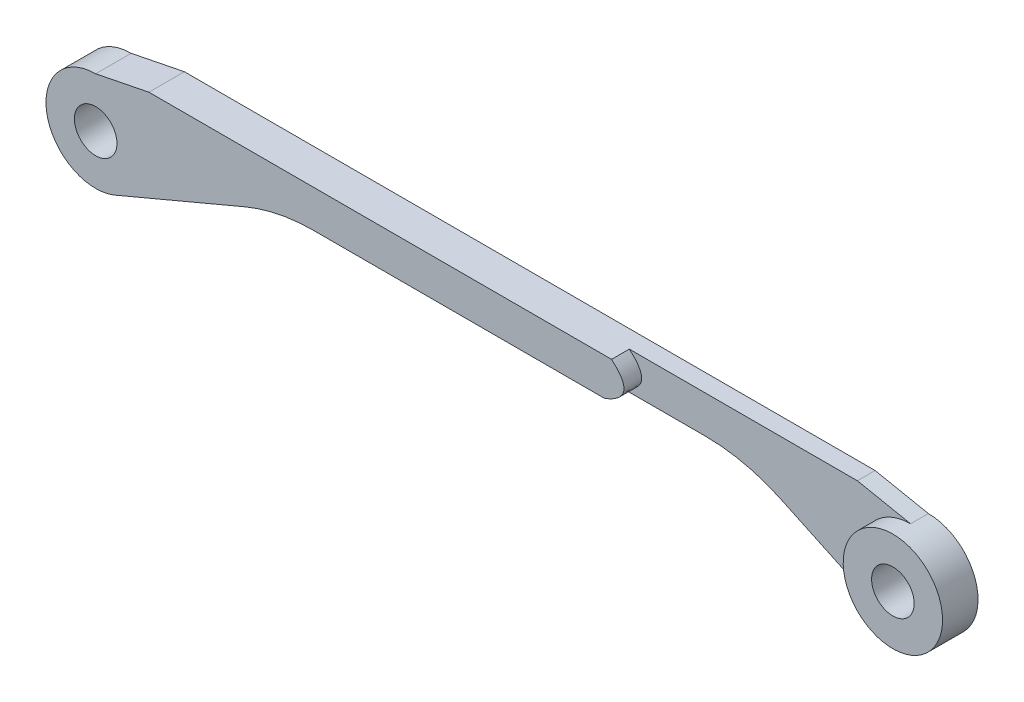
ISO-10303-21;
HEADER;
FILE_DESCRIPTION(('STEP AP214'),'2;1');
FILE_NAME('part.step','',(''),(''),'','','');
FILE_SCHEMA(('AUTOMOTIVE_DESIGN { 1 0 10303 214 1 1 1 1 }'));
ENDSEC;
DATA;
#1=APPLICATION_CONTEXT('core data for automotive mechanical design processes');
#2=APPLICATION_PROTOCOL_DEFINITION('international standard','automotive_design',2000,#1);
#3=PRODUCT_CONTEXT('',#1,'mechanical');
#4=PRODUCT('Part','Part','',(#3));
#5=PRODUCT_RELATED_PRODUCT_CATEGORY('part','',(#4));
#6=PRODUCT_DEFINITION_FORMATION('','',#4);
#7=PRODUCT_DEFINITION_CONTEXT('part definition',#1,'design');
#8=PRODUCT_DEFINITION('design','',#6,#7);
#9=PRODUCT_DEFINITION_SHAPE('','',#8);
#10=(LENGTH_UNIT() NAMED_UNIT(*) SI_UNIT(.MILLI.,.METRE.));
#11=(NAMED_UNIT(*) PLANE_ANGLE_UNIT() SI_UNIT($,.RADIAN.));
#12=(NAMED_UNIT(*) SI_UNIT($,.STERADIAN.) SOLID_ANGLE_UNIT());
#13=UNCERTAINTY_MEASURE_WITH_UNIT(LENGTH_MEASURE(1.E-05),#10,'distance_accuracy_value','');
#14=(GEOMETRIC_REPRESENTATION_CONTEXT(3) GLOBAL_UNCERTAINTY_ASSIGNED_CONTEXT((#13)) GLOBAL_UNIT_ASSIGNED_CONTEXT((#10,
#11,#12)) REPRESENTATION_CONTEXT('',''));
#15=CARTESIAN_POINT('',(0.,0.,0.));
#16=DIRECTION('',(0.,0.,1.));
#17=DIRECTION('',(1.,0.,0.));
#18=AXIS2_PLACEMENT_3D('',#15,#16,#17);
#19=CARTESIAN_POINT('',(-57.845130198065,-43.5295238724371,5.));
#20=DIRECTION('',(0.,0.,1.));
#21=DIRECTION('',(1.,0.,0.));
#22=AXIS2_PLACEMENT_3D('',#19,#20,#21);
#23=PLANE('',#22);
#24=DIRECTION('',(0.905027741446098,-0.425352544617962,0.));
#25=VECTOR('',#24,1.);
#26=CARTESIAN_POINT('',(-5.95493562465147,-12.6703883802454,5.));
#27=LINE('',#26,#25);
#28=CARTESIAN_POINT('',(-36.577502967167,1.7218631998678,5.));
#29=VERTEX_POINT('',#28);
#30=CARTESIAN_POINT('',(-5.95493562465147,-12.6703883802454,5.));
#31=VERTEX_POINT('',#30);
#32=EDGE_CURVE('E186',#29,#31,#27,.T.);
#33=ORIENTED_EDGE('',*,*,#32,.T.);
#34=CARTESIAN_POINT('',(0.,0.,5.));
#35=DIRECTION('',(0.,0.,1.));
#36=DIRECTION('',(1.,0.,0.));
#37=AXIS2_PLACEMENT_3D('',#34,#35,#36);
#38=CIRCLE('',#37,14.);
#39=CARTESIAN_POINT('',(0.,14.,5.));
#40=VERTEX_POINT('',#39);
#41=EDGE_CURVE('E170',#40,#31,#38,.T.);
#42=ORIENTED_EDGE('',*,*,#41,.F.);
#43=DIRECTION('',(-0.98058067569092,0.196116135138185,0.));
#44=VECTOR('',#43,1.);
#45=CARTESIAN_POINT('',(2.69230769230771,13.4615384615385,5.));
#46=LINE('',#45,#44);
#47=CARTESIAN_POINT('',(-15.,17.,5.));
#48=VERTEX_POINT('',#47);
#49=EDGE_CURVE('E181',#40,#48,#46,.T.);
#50=ORIENTED_EDGE('',*,*,#49,.T.);
#51=DIRECTION('',(-1.,0.,0.));
#52=VECTOR('',#51,1.);
#53=CARTESIAN_POINT('',(0.,17.,5.));
#54=LINE('',#53,#52);
#55=CARTESIAN_POINT('',(-79.2716069594435,17.,5.));
#56=VERTEX_POINT('',#55);
#57=EDGE_CURVE('E185',#48,#56,#54,.T.);
#58=ORIENTED_EDGE('',*,*,#57,.T.);
#59=CARTESIAN_POINT('',(-79.2716069594435,17.,5.));
#60=CARTESIAN_POINT('',(-71.4034946211549,10.2559083754016,5.));
#61=CARTESIAN_POINT('',(-81.2732419921328,6.47047612756292,5.));
#62=B_SPLINE_CURVE_WITH_KNOTS('',2,(#59,#60,#61),.UNSPECIFIED.,.F.,.F.,(3,3),(0.,1.),.UNSPECIFIED.);
#63=CARTESIAN_POINT('',(-81.2732419921328,6.47047612756292,5.));
#64=VERTEX_POINT('',#63);
#65=EDGE_CURVE('E209',#56,#64,#62,.T.);
#66=ORIENTED_EDGE('',*,*,#65,.T.);
#67=DIRECTION('',(1.,0.,0.));
#68=VECTOR('',#67,1.);
#69=CARTESIAN_POINT('',(0.,6.47047612756292,5.));
#70=LINE('',#69,#68);
#71=CARTESIAN_POINT('',(-57.845130198065,6.47047612756292,5.));
#72=VERTEX_POINT('',#71);
#73=EDGE_CURVE('E90',#64,#72,#70,.T.);
#74=ORIENTED_EDGE('',*,*,#73,.T.);
#75=CARTESIAN_POINT('',(-57.845130198065,-43.5295238724371,5.));
#76=DIRECTION('',(0.,0.,1.));
#77=DIRECTION('',(1.,0.,0.));
#78=AXIS2_PLACEMENT_3D('',#75,#76,#77);
#79=CIRCLE('',#78,50.);
#80=EDGE_CURVE('E201',#29,#72,#79,.T.);
#81=ORIENTED_EDGE('',*,*,#80,.F.);
#82=EDGE_LOOP('',(#33,#42,#50,#58,#66,#74,#81));
#83=FACE_BOUND('',#82,.T.);
#84=ADVANCED_FACE('F74',(#83),#23,.T.);
#85=CARTESIAN_POINT('',(-5.95493562465147,-12.6703883802454,10.));
#86=DIRECTION('',(0.425352544617962,0.905027741446098,0.));
#87=DIRECTION('',(-0.905027741446098,0.425352544617962,0.));
#88=AXIS2_PLACEMENT_3D('',#85,#86,#87);
#89=PLANE('',#88);
#90=ORIENTED_EDGE('',*,*,#32,.F.);
#91=DIRECTION('',(0.,0.,-1.));
#92=VECTOR('',#91,1.);
#93=CARTESIAN_POINT('',(-36.5775029671669,1.7218631998678,0.));
#94=LINE('',#93,#92);
#95=CARTESIAN_POINT('',(-36.577502967167,1.7218631998678,0.));
#96=VERTEX_POINT('',#95);
#97=EDGE_CURVE('E561',#29,#96,#94,.T.);
#98=ORIENTED_EDGE('',*,*,#97,.T.);
#99=DIRECTION('',(0.905027741446098,-0.425352544617962,0.));
#100=VECTOR('',#99,1.);
#101=CARTESIAN_POINT('',(-5.95493562465147,-12.6703883802454,0.));
#102=LINE('',#101,#100);
#103=CARTESIAN_POINT('',(-5.95493562465147,-12.6703883802454,0.));
#104=VERTEX_POINT('',#103);
#105=EDGE_CURVE('E512',#96,#104,#102,.T.);
#106=ORIENTED_EDGE('',*,*,#105,.T.);
#107=DIRECTION('',(0.,0.,-1.));
#108=VECTOR('',#107,1.);
#109=CARTESIAN_POINT('',(-5.95493562465147,-12.6703883802454,10.));
#110=LINE('',#109,#108);
#111=EDGE_CURVE('E177',#31,#104,#110,.T.);
#112=ORIENTED_EDGE('',*,*,#111,.F.);
#113=EDGE_LOOP('',(#90,#98,#106,#112));
#114=FACE_BOUND('',#113,.T.);
#115=ADVANCED_FACE('F270',(#114),#89,.F.);
#116=CARTESIAN_POINT('',(0.,0.,10.));
#117=DIRECTION('',(0.,0.,-1.));
#118=DIRECTION('',(-1.,0.,0.));
#119=AXIS2_PLACEMENT_3D('',#116,#117,#118);
#120=CYLINDRICAL_SURFACE('',#119,14.);
#121=DIRECTION('',(0.,0.,-1.));
#122=VECTOR('',#121,1.);
#123=CARTESIAN_POINT('',(0.,14.,10.));
#124=LINE('',#123,#122);
#125=CARTESIAN_POINT('',(0.,14.,0.));
#126=VERTEX_POINT('',#125);
#127=EDGE_CURVE('E165',#40,#126,#124,.T.);
#128=ORIENTED_EDGE('',*,*,#127,.F.);
#129=ORIENTED_EDGE('',*,*,#41,.T.);
#130=ORIENTED_EDGE('',*,*,#111,.T.);
#131=CARTESIAN_POINT('',(0.,0.,0.));
#132=DIRECTION('',(0.,0.,1.));
#133=DIRECTION('',(1.,0.,0.));
#134=AXIS2_PLACEMENT_3D('',#131,#132,#133);
#135=CIRCLE('',#134,14.);
#136=EDGE_CURVE('E172',#104,#126,#135,.T.);
#137=ORIENTED_EDGE('',*,*,#136,.T.);
#138=EDGE_LOOP('',(#128,#129,#130,#137));
#139=FACE_BOUND('',#138,.T.);
#140=CARTESIAN_POINT('',(0.,0.,10.));
#141=DIRECTION('',(0.,0.,1.));
#142=DIRECTION('',(1.,0.,0.));
#143=AXIS2_PLACEMENT_3D('',#140,#141,#142);
#144=CIRCLE('',#143,14.);
#145=CARTESIAN_POINT('',(14.,0.,10.));
#146=VERTEX_POINT('',#145);
#147=EDGE_CURVE('E195',#146,#146,#144,.T.);
#148=ORIENTED_EDGE('',*,*,#147,.F.);
#149=EDGE_LOOP('',(#148));
#150=FACE_BOUND('',#149,.T.);
#151=ADVANCED_FACE('F167',(#139,#150),#120,.T.);
#152=CARTESIAN_POINT('',(2.69230769230771,13.4615384615385,10.));
#153=DIRECTION('',(0.196116135138185,0.98058067569092,0.));
#154=DIRECTION('',(-0.98058067569092,0.196116135138185,0.));
#155=AXIS2_PLACEMENT_3D('',#152,#153,#154);
#156=PLANE('',#155);
#157=DIRECTION('',(0.,0.,-1.));
#158=VECTOR('',#157,1.);
#159=CARTESIAN_POINT('',(-15.,17.,10.));
#160=LINE('',#159,#158);
#161=CARTESIAN_POINT('',(-15.,17.,0.));
#162=VERTEX_POINT('',#161);
#163=EDGE_CURVE('E178',#48,#162,#160,.T.);
#164=ORIENTED_EDGE('',*,*,#163,.F.);
#165=ORIENTED_EDGE('',*,*,#49,.F.);
#166=ORIENTED_EDGE('',*,*,#127,.T.);
#167=DIRECTION('',(0.98058067569092,-0.196116135138185,0.));
#168=VECTOR('',#167,1.);
#169=CARTESIAN_POINT('',(2.69230769230771,13.4615384615385,0.));
#170=LINE('',#169,#168);
#171=EDGE_CURVE('E518',#162,#126,#170,.T.);
#172=ORIENTED_EDGE('',*,*,#171,.F.);
#173=EDGE_LOOP('',(#164,#165,#166,#172));
#174=FACE_BOUND('',#173,.T.);
#175=ADVANCED_FACE('F182',(#174),#156,.T.);
#176=CARTESIAN_POINT('',(0.,0.,10.));
#177=DIRECTION('',(0.,0.,-1.));
#178=DIRECTION('',(-1.,0.,0.));
#179=AXIS2_PLACEMENT_3D('',#176,#177,#178);
#180=CYLINDRICAL_SURFACE('',#179,6.);
#181=CARTESIAN_POINT('',(0.,0.,0.));
#182=DIRECTION('',(0.,0.,1.));
#183=DIRECTION('',(1.,0.,0.));
#184=AXIS2_PLACEMENT_3D('',#181,#182,#183);
#185=CIRCLE('',#184,6.);
#186=CARTESIAN_POINT('',(6.,0.,0.));
#187=VERTEX_POINT('',#186);
#188=EDGE_CURVE('E538',#187,#187,#185,.T.);
#189=ORIENTED_EDGE('',*,*,#188,.F.);
#190=EDGE_LOOP('',(#189));
#191=FACE_BOUND('',#190,.T.);
#192=CARTESIAN_POINT('',(0.,0.,10.));
#193=DIRECTION('',(0.,0.,1.));
#194=DIRECTION('',(1.,0.,0.));
#195=AXIS2_PLACEMENT_3D('',#192,#193,#194);
#196=CIRCLE('',#195,6.);
#197=CARTESIAN_POINT('',(6.,0.,10.));
#198=VERTEX_POINT('',#197);
#199=EDGE_CURVE('E191',#198,#198,#196,.F.);
#200=ORIENTED_EDGE('',*,*,#199,.F.);
#201=EDGE_LOOP('',(#200));
#202=FACE_BOUND('',#201,.T.);
#203=ADVANCED_FACE('F243',(#191,#202),#180,.F.);
#204=CARTESIAN_POINT('',(-57.845130198065,-43.5295238724371,10.));
#205=DIRECTION('',(0.,0.,1.));
#206=DIRECTION('',(1.,0.,0.));
#207=AXIS2_PLACEMENT_3D('',#204,#205,#206);
#208=CYLINDRICAL_SURFACE('',#207,50.);
#209=ORIENTED_EDGE('',*,*,#80,.T.);
#210=DIRECTION('',(0.,0.,-1.));
#211=VECTOR('',#210,1.);
#212=CARTESIAN_POINT('',(-57.845130198065,6.47047612756292,10.));
#213=LINE('',#212,#211);
#214=CARTESIAN_POINT('',(-57.845130198065,6.47047612756292,0.));
#215=VERTEX_POINT('',#214);
#216=EDGE_CURVE('E566',#215,#72,#213,.F.);
#217=ORIENTED_EDGE('',*,*,#216,.F.);
#218=CARTESIAN_POINT('',(-57.845130198065,-43.5295238724371,0.));
#219=DIRECTION('',(0.,0.,1.));
#220=DIRECTION('',(1.,0.,0.));
#221=AXIS2_PLACEMENT_3D('',#218,#219,#220);
#222=CIRCLE('',#221,50.);
#223=EDGE_CURVE('E572',#96,#215,#222,.T.);
#224=ORIENTED_EDGE('',*,*,#223,.F.);
#225=ORIENTED_EDGE('',*,*,#97,.F.);
#226=EDGE_LOOP('',(#209,#217,#224,#225));
#227=FACE_BOUND('',#226,.T.);
#228=ADVANCED_FACE('F246',(#227),#208,.F.);
#229=CARTESIAN_POINT('',(0.,17.,10.));
#230=DIRECTION('',(0.,1.,0.));
#231=DIRECTION('',(-1.,0.,0.));
#232=AXIS2_PLACEMENT_3D('',#229,#230,#231);
#233=PLANE('',#232);
#234=DIRECTION('',(0.,0.,1.));
#235=VECTOR('',#234,1.);
#236=CARTESIAN_POINT('',(-79.2716069594435,17.,5.));
#237=LINE('',#236,#235);
#238=CARTESIAN_POINT('',(-79.2716069594435,17.,10.));
#239=VERTEX_POINT('',#238);
#240=EDGE_CURVE('E215',#56,#239,#237,.T.);
#241=ORIENTED_EDGE('',*,*,#240,.F.);
#242=ORIENTED_EDGE('',*,*,#57,.F.);
#243=ORIENTED_EDGE('',*,*,#163,.T.);
#244=DIRECTION('',(1.,0.,0.));
#245=VECTOR('',#244,1.);
#246=CARTESIAN_POINT('',(0.,17.,0.));
#247=LINE('',#246,#245);
#248=CARTESIAN_POINT('',(-209.65,17.,0.));
#249=VERTEX_POINT('',#248);
#250=EDGE_CURVE('E521',#249,#162,#247,.T.);
#251=ORIENTED_EDGE('',*,*,#250,.F.);
#252=DIRECTION('',(0.,0.,-1.));
#253=VECTOR('',#252,1.);
#254=CARTESIAN_POINT('',(-209.65,17.,10.));
#255=LINE('',#254,#253);
#256=CARTESIAN_POINT('',(-209.65,17.,10.));
#257=VERTEX_POINT('',#256);
#258=EDGE_CURVE('E554',#257,#249,#255,.T.);
#259=ORIENTED_EDGE('',*,*,#258,.F.);
#260=DIRECTION('',(1.,0.,0.));
#261=VECTOR('',#260,1.);
#262=CARTESIAN_POINT('',(0.,17.,10.));
#263=LINE('',#262,#261);
#264=EDGE_CURVE('E546',#257,#239,#263,.T.);
#265=ORIENTED_EDGE('',*,*,#264,.T.);
#266=EDGE_LOOP('',(#241,#242,#243,#251,#259,#265));
#267=FACE_BOUND('',#266,.T.);
#268=ADVANCED_FACE('F261',(#267),#233,.T.);
#269=CARTESIAN_POINT('',(-11.3326923076922,56.6634615384613,10.));
#270=DIRECTION('',(0.196116135138183,-0.98058067569092,0.));
#271=DIRECTION('',(0.98058067569092,0.196116135138183,0.));
#272=AXIS2_PLACEMENT_3D('',#269,#270,#271);
#273=PLANE('',#272);
#274=DIRECTION('',(-0.98058067569092,-0.196116135138183,0.));
#275=VECTOR('',#274,1.);
#276=CARTESIAN_POINT('',(-11.3326923076922,56.6634615384613,0.));
#277=LINE('',#276,#275);
#278=CARTESIAN_POINT('',(-224.65,14.,0.));
#279=VERTEX_POINT('',#278);
#280=EDGE_CURVE('E525',#249,#279,#277,.T.);
#281=ORIENTED_EDGE('',*,*,#280,.T.);
#282=DIRECTION('',(0.,0.,-1.));
#283=VECTOR('',#282,1.);
#284=CARTESIAN_POINT('',(-224.65,14.,10.));
#285=LINE('',#284,#283);
#286=CARTESIAN_POINT('',(-224.65,14.,10.));
#287=VERTEX_POINT('',#286);
#288=EDGE_CURVE('E550',#287,#279,#285,.T.);
#289=ORIENTED_EDGE('',*,*,#288,.F.);
#290=DIRECTION('',(-0.98058067569092,-0.196116135138183,0.));
#291=VECTOR('',#290,1.);
#292=CARTESIAN_POINT('',(-11.3326923076922,56.6634615384613,10.));
#293=LINE('',#292,#291);
#294=EDGE_CURVE('E596',#257,#287,#293,.T.);
#295=ORIENTED_EDGE('',*,*,#294,.F.);
#296=ORIENTED_EDGE('',*,*,#258,.T.);
#297=EDGE_LOOP('',(#281,#289,#295,#296));
#298=FACE_BOUND('',#297,.T.);
#299=ADVANCED_FACE('F257',(#298),#273,.F.);
#300=CARTESIAN_POINT('',(-224.65,0.,10.));
#301=DIRECTION('',(0.,0.,-1.));
#302=DIRECTION('',(-1.,0.,0.));
#303=AXIS2_PLACEMENT_3D('',#300,#301,#302);
#304=CYLINDRICAL_SURFACE('',#303,14.);
#305=CARTESIAN_POINT('',(-224.65,0.,0.));
#306=DIRECTION('',(0.,0.,1.));
#307=DIRECTION('',(1.,0.,0.));
#308=AXIS2_PLACEMENT_3D('',#305,#306,#307);
#309=CIRCLE('',#308,14.);
#310=CARTESIAN_POINT('',(-219.205808477167,-12.8980920551341,0.));
#311=VERTEX_POINT('',#310);
#312=EDGE_CURVE('E528',#279,#311,#309,.T.);
#313=ORIENTED_EDGE('',*,*,#312,.T.);
#314=DIRECTION('',(0.,0.,-1.));
#315=VECTOR('',#314,1.);
#316=CARTESIAN_POINT('',(-219.205808477167,-12.8980920551341,10.));
#317=LINE('',#316,#315);
#318=CARTESIAN_POINT('',(-219.205808477167,-12.8980920551341,10.));
#319=VERTEX_POINT('',#318);
#320=EDGE_CURVE('E506',#319,#311,#317,.T.);
#321=ORIENTED_EDGE('',*,*,#320,.F.);
#322=CARTESIAN_POINT('',(-224.65,0.,10.));
#323=DIRECTION('',(0.,0.,1.));
#324=DIRECTION('',(1.,0.,0.));
#325=AXIS2_PLACEMENT_3D('',#322,#323,#324);
#326=CIRCLE('',#325,14.);
#327=EDGE_CURVE('E508',#287,#319,#326,.T.);
#328=ORIENTED_EDGE('',*,*,#327,.F.);
#329=ORIENTED_EDGE('',*,*,#288,.T.);
#330=EDGE_LOOP('',(#313,#321,#328,#329));
#331=FACE_BOUND('',#330,.T.);
#332=ADVANCED_FACE('F254',(#331),#304,.T.);
#333=CARTESIAN_POINT('',(-28.527497627278,67.5858461180238,10.));
#334=DIRECTION('',(0.38887082305951,-0.921292289652431,0.));
#335=DIRECTION('',(0.921292289652431,0.38887082305951,0.));
#336=AXIS2_PLACEMENT_3D('',#333,#334,#335);
#337=PLANE('',#336);
#338=DIRECTION('',(-0.921292289652431,-0.38887082305951,0.));
#339=VECTOR('',#338,1.);
#340=CARTESIAN_POINT('',(-28.527497627278,67.5858461180238,0.));
#341=LINE('',#340,#339);
#342=CARTESIAN_POINT('',(-182.642324278252,2.53509061018449,0.));
#343=VERTEX_POINT('',#342);
#344=EDGE_CURVE('E532',#343,#311,#341,.T.);
#345=ORIENTED_EDGE('',*,*,#344,.F.);
#346=DIRECTION('',(0.,0.,-1.));
#347=VECTOR('',#346,1.);
#348=CARTESIAN_POINT('',(-182.642324278252,2.53509061018448,10.));
#349=LINE('',#348,#347);
#350=CARTESIAN_POINT('',(-182.642324278252,2.53509061018449,10.));
#351=VERTEX_POINT('',#350);
#352=EDGE_CURVE('E98',#343,#351,#349,.F.);
#353=ORIENTED_EDGE('',*,*,#352,.T.);
#354=DIRECTION('',(-0.921292289652431,-0.38887082305951,0.));
#355=VECTOR('',#354,1.);
#356=CARTESIAN_POINT('',(-28.527497627278,67.5858461180238,10.));
#357=LINE('',#356,#355);
#358=EDGE_CURVE('E495',#351,#319,#357,.T.);
#359=ORIENTED_EDGE('',*,*,#358,.T.);
#360=ORIENTED_EDGE('',*,*,#320,.T.);
#361=EDGE_LOOP('',(#345,#353,#359,#360));
#362=FACE_BOUND('',#361,.T.);
#363=ADVANCED_FACE('F250',(#362),#337,.T.);
#364=CARTESIAN_POINT('',(0.,6.47047612756292,10.));
#365=DIRECTION('',(0.,1.,0.));
#366=DIRECTION('',(-1.,0.,0.));
#367=AXIS2_PLACEMENT_3D('',#364,#365,#366);
#368=PLANE('',#367);
#369=ORIENTED_EDGE('',*,*,#73,.F.);
#370=DIRECTION('',(0.,0.,1.));
#371=VECTOR('',#370,1.);
#372=CARTESIAN_POINT('',(-81.2732419921328,6.47047612756292,5.));
#373=LINE('',#372,#371);
#374=CARTESIAN_POINT('',(-81.2732419921328,6.47047612756292,10.));
#375=VERTEX_POINT('',#374);
#376=EDGE_CURVE('E499',#64,#375,#373,.T.);
#377=ORIENTED_EDGE('',*,*,#376,.T.);
#378=DIRECTION('',(1.,0.,0.));
#379=VECTOR('',#378,1.);
#380=CARTESIAN_POINT('',(0.,6.47047612756292,10.));
#381=LINE('',#380,#379);
#382=CARTESIAN_POINT('',(-163.198783125276,6.47047612756292,10.));
#383=VERTEX_POINT('',#382);
#384=EDGE_CURVE('E493',#383,#375,#381,.T.);
#385=ORIENTED_EDGE('',*,*,#384,.F.);
#386=DIRECTION('',(0.,0.,-1.));
#387=VECTOR('',#386,1.);
#388=CARTESIAN_POINT('',(-163.198783125276,6.47047612756292,10.));
#389=LINE('',#388,#387);
#390=CARTESIAN_POINT('',(-163.198783125276,6.47047612756292,0.));
#391=VERTEX_POINT('',#390);
#392=EDGE_CURVE('E488',#383,#391,#389,.T.);
#393=ORIENTED_EDGE('',*,*,#392,.T.);
#394=DIRECTION('',(1.,0.,0.));
#395=VECTOR('',#394,1.);
#396=CARTESIAN_POINT('',(0.,6.47047612756292,0.));
#397=LINE('',#396,#395);
#398=EDGE_CURVE('E535',#391,#215,#397,.T.);
#399=ORIENTED_EDGE('',*,*,#398,.T.);
#400=ORIENTED_EDGE('',*,*,#216,.T.);
#401=EDGE_LOOP('',(#369,#377,#385,#393,#399,#400));
#402=FACE_BOUND('',#401,.T.);
#403=ADVANCED_FACE('F241',(#402),#368,.F.);
#404=CARTESIAN_POINT('',(-224.65,0.,10.));
#405=DIRECTION('',(0.,0.,-1.));
#406=DIRECTION('',(-1.,0.,0.));
#407=AXIS2_PLACEMENT_3D('',#404,#405,#406);
#408=CYLINDRICAL_SURFACE('',#407,5.99999999999999);
#409=CARTESIAN_POINT('',(-224.65,0.,10.));
#410=DIRECTION('',(0.,0.,1.));
#411=DIRECTION('',(1.,0.,0.));
#412=AXIS2_PLACEMENT_3D('',#409,#410,#411);
#413=CIRCLE('',#412,5.99999999999999);
#414=CARTESIAN_POINT('',(-218.65,0.,10.));
#415=VERTEX_POINT('',#414);
#416=EDGE_CURVE('E501',#415,#415,#413,.T.);
#417=ORIENTED_EDGE('',*,*,#416,.T.);
#418=EDGE_LOOP('',(#417));
#419=FACE_BOUND('',#418,.T.);
#420=CARTESIAN_POINT('',(-224.65,0.,0.));
#421=DIRECTION('',(0.,0.,1.));
#422=DIRECTION('',(1.,0.,0.));
#423=AXIS2_PLACEMENT_3D('',#420,#421,#422);
#424=CIRCLE('',#423,5.99999999999999);
#425=CARTESIAN_POINT('',(-218.65,0.,0.));
#426=VERTEX_POINT('',#425);
#427=EDGE_CURVE('E542',#426,#426,#424,.T.);
#428=ORIENTED_EDGE('',*,*,#427,.F.);
#429=EDGE_LOOP('',(#428));
#430=FACE_BOUND('',#429,.T.);
#431=ADVANCED_FACE('F234',(#419,#430),#408,.F.);
#432=CARTESIAN_POINT('',(0.,0.,10.));
#433=DIRECTION('',(0.,0.,1.));
#434=DIRECTION('',(1.,0.,0.));
#435=AXIS2_PLACEMENT_3D('',#432,#433,#434);
#436=PLANE('',#435);
#437=CARTESIAN_POINT('',(-79.2716069594435,17.,10.));
#438=CARTESIAN_POINT('',(-71.4034946211549,10.2559083754016,10.));
#439=CARTESIAN_POINT('',(-81.2732419921328,6.47047612756292,10.));
#440=B_SPLINE_CURVE_WITH_KNOTS('',2,(#437,#438,#439),.UNSPECIFIED.,.F.,.F.,(3,3),(0.,1.),.UNSPECIFIED.);
#441=EDGE_CURVE('E202',#239,#375,#440,.T.);
#442=ORIENTED_EDGE('',*,*,#441,.F.);
#443=ORIENTED_EDGE('',*,*,#264,.F.);
#444=ORIENTED_EDGE('',*,*,#294,.T.);
#445=ORIENTED_EDGE('',*,*,#327,.T.);
#446=ORIENTED_EDGE('',*,*,#358,.F.);
#447=CARTESIAN_POINT('',(-163.198783125276,-43.5295238724371,10.));
#448=DIRECTION('',(0.,0.,1.));
#449=DIRECTION('',(1.,0.,0.));
#450=AXIS2_PLACEMENT_3D('',#447,#448,#449);
#451=CIRCLE('',#450,50.);
#452=EDGE_CURVE('E12',#351,#383,#451,.F.);
#453=ORIENTED_EDGE('',*,*,#452,.T.);
#454=ORIENTED_EDGE('',*,*,#384,.T.);
#455=EDGE_LOOP('',(#442,#443,#444,#445,#446,#453,#454));
#456=FACE_BOUND('',#455,.T.);
#457=ORIENTED_EDGE('',*,*,#416,.F.);
#458=EDGE_LOOP('',(#457));
#459=FACE_BOUND('',#458,.T.);
#460=ADVANCED_FACE('F230',(#456,#459),#436,.T.);
#461=CARTESIAN_POINT('',(0.,0.,0.));
#462=DIRECTION('',(0.,0.,1.));
#463=DIRECTION('',(1.,0.,0.));
#464=AXIS2_PLACEMENT_3D('',#461,#462,#463);
#465=PLANE('',#464);
#466=ORIENTED_EDGE('',*,*,#105,.F.);
#467=ORIENTED_EDGE('',*,*,#223,.T.);
#468=ORIENTED_EDGE('',*,*,#398,.F.);
#469=CARTESIAN_POINT('',(-163.198783125276,-43.5295238724371,0.));
#470=DIRECTION('',(0.,0.,1.));
#471=DIRECTION('',(1.,0.,0.));
#472=AXIS2_PLACEMENT_3D('',#469,#470,#471);
#473=CIRCLE('',#472,50.);
#474=EDGE_CURVE('E83',#391,#343,#473,.T.);
#475=ORIENTED_EDGE('',*,*,#474,.T.);
#476=ORIENTED_EDGE('',*,*,#344,.T.);
#477=ORIENTED_EDGE('',*,*,#312,.F.);
#478=ORIENTED_EDGE('',*,*,#280,.F.);
#479=ORIENTED_EDGE('',*,*,#250,.T.);
#480=ORIENTED_EDGE('',*,*,#171,.T.);
#481=ORIENTED_EDGE('',*,*,#136,.F.);
#482=EDGE_LOOP('',(#466,#467,#468,#475,#476,#477,#478,#479,#480,#481));
#483=FACE_BOUND('',#482,.T.);
#484=ORIENTED_EDGE('',*,*,#188,.T.);
#485=EDGE_LOOP('',(#484));
#486=FACE_BOUND('',#485,.T.);
#487=ORIENTED_EDGE('',*,*,#427,.T.);
#488=EDGE_LOOP('',(#487));
#489=FACE_BOUND('',#488,.T.);
#490=ADVANCED_FACE('F233',(#483,#486,#489),#465,.F.);
#491=CARTESIAN_POINT('',(-163.198783125276,-43.5295238724371,10.));
#492=DIRECTION('',(0.,0.,-1.));
#493=DIRECTION('',(-1.,0.,0.));
#494=AXIS2_PLACEMENT_3D('',#491,#492,#493);
#495=CYLINDRICAL_SURFACE('',#494,50.);
#496=ORIENTED_EDGE('',*,*,#452,.F.);
#497=ORIENTED_EDGE('',*,*,#352,.F.);
#498=ORIENTED_EDGE('',*,*,#474,.F.);
#499=ORIENTED_EDGE('',*,*,#392,.F.);
#500=EDGE_LOOP('',(#496,#497,#498,#499));
#501=FACE_BOUND('',#500,.T.);
#502=ADVANCED_FACE('F76',(#501),#495,.F.);
#503=DIRECTION('',(0.,0.,1.));
#504=VECTOR('',#503,1.);
#505=SURFACE_OF_LINEAR_EXTRUSION('',#62,#504);
#506=ORIENTED_EDGE('',*,*,#441,.T.);
#507=ORIENTED_EDGE('',*,*,#376,.F.);
#508=ORIENTED_EDGE('',*,*,#65,.F.);
#509=ORIENTED_EDGE('',*,*,#240,.T.);
#510=EDGE_LOOP('',(#506,#507,#508,#509));
#511=FACE_BOUND('',#510,.T.);
#512=ADVANCED_FACE('F223',(#511),#505,.F.);
#513=CARTESIAN_POINT('',(0.,0.,10.));
#514=DIRECTION('',(0.,0.,1.));
#515=DIRECTION('',(1.,0.,0.));
#516=AXIS2_PLACEMENT_3D('',#513,#514,#515);
#517=PLANE('',#516);
#518=ORIENTED_EDGE('',*,*,#199,.T.);
#519=EDGE_LOOP('',(#518));
#520=FACE_BOUND('',#519,.T.);
#521=ORIENTED_EDGE('',*,*,#147,.T.);
#522=EDGE_LOOP('',(#521));
#523=FACE_BOUND('',#522,.T.);
#524=ADVANCED_FACE('F227',(#520,#523),#517,.T.);
#525=CLOSED_SHELL('',(#84,#115,#151,#175,#203,#228,#268,#299,#332,#363,#403,#431,#460,#490,#502,
#512,#524));
#526=MANIFOLD_SOLID_BREP('B2',#525);
#527=ADVANCED_BREP_SHAPE_REPRESENTATION('',(#18,#526),#14);
#528=SHAPE_DEFINITION_REPRESENTATION(#9,#527);
ENDSEC;
END-ISO-10303-21;
